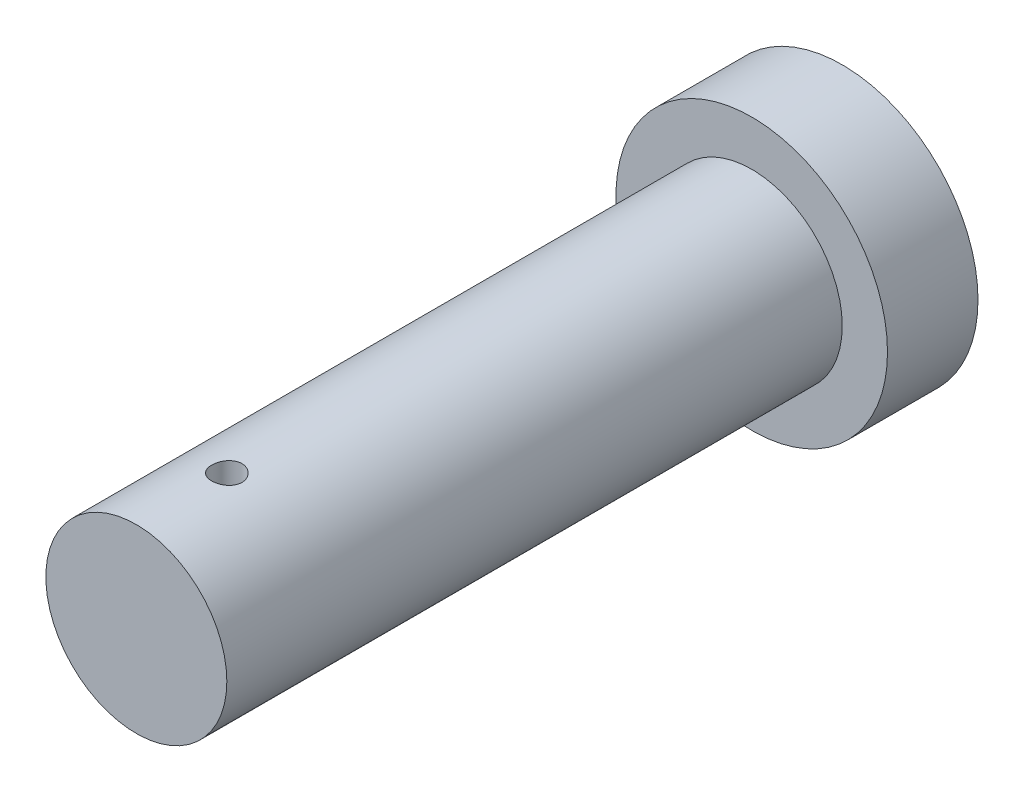
ISO-10303-21;
HEADER;
FILE_DESCRIPTION(('STEP AP214'),'2;1');
FILE_NAME('part.step','',(''),(''),'','','');
FILE_SCHEMA(('AUTOMOTIVE_DESIGN { 1 0 10303 214 1 1 1 1 }'));
ENDSEC;
DATA;
#1=APPLICATION_CONTEXT('core data for automotive mechanical design processes');
#2=APPLICATION_PROTOCOL_DEFINITION('international standard','automotive_design',2000,#1);
#3=PRODUCT_CONTEXT('',#1,'mechanical');
#4=PRODUCT('Part','Part','',(#3));
#5=PRODUCT_RELATED_PRODUCT_CATEGORY('part','',(#4));
#6=PRODUCT_DEFINITION_FORMATION('','',#4);
#7=PRODUCT_DEFINITION_CONTEXT('part definition',#1,'design');
#8=PRODUCT_DEFINITION('design','',#6,#7);
#9=PRODUCT_DEFINITION_SHAPE('','',#8);
#10=(LENGTH_UNIT() NAMED_UNIT(*) SI_UNIT(.MILLI.,.METRE.));
#11=(NAMED_UNIT(*) PLANE_ANGLE_UNIT() SI_UNIT($,.RADIAN.));
#12=(NAMED_UNIT(*) SI_UNIT($,.STERADIAN.) SOLID_ANGLE_UNIT());
#13=UNCERTAINTY_MEASURE_WITH_UNIT(LENGTH_MEASURE(1.E-05),#10,'distance_accuracy_value','');
#14=(GEOMETRIC_REPRESENTATION_CONTEXT(3) GLOBAL_UNCERTAINTY_ASSIGNED_CONTEXT((#13)) GLOBAL_UNIT_ASSIGNED_CONTEXT((#10,
#11,#12)) REPRESENTATION_CONTEXT('',''));
#15=CARTESIAN_POINT('',(0.,0.,0.));
#16=DIRECTION('',(0.,0.,1.));
#17=DIRECTION('',(1.,0.,0.));
#18=AXIS2_PLACEMENT_3D('',#15,#16,#17);
#19=CARTESIAN_POINT('',(0.,0.,15.));
#20=DIRECTION('',(0.,0.,-1.));
#21=DIRECTION('',(-1.,0.,0.));
#22=AXIS2_PLACEMENT_3D('',#19,#20,#21);
#23=CYLINDRICAL_SURFACE('',#22,22.5);
#24=CARTESIAN_POINT('',(0.,0.,15.));
#25=DIRECTION('',(0.,0.,1.));
#26=DIRECTION('',(1.,0.,0.));
#27=AXIS2_PLACEMENT_3D('',#24,#25,#26);
#28=CIRCLE('',#27,22.5);
#29=CARTESIAN_POINT('',(22.5,0.,15.));
#30=VERTEX_POINT('',#29);
#31=EDGE_CURVE('E54',#30,#30,#28,.T.);
#32=ORIENTED_EDGE('',*,*,#31,.F.);
#33=EDGE_LOOP('',(#32));
#34=FACE_BOUND('',#33,.T.);
#35=CARTESIAN_POINT('',(0.,0.,0.));
#36=DIRECTION('',(0.,0.,1.));
#37=DIRECTION('',(1.,0.,0.));
#38=AXIS2_PLACEMENT_3D('',#35,#36,#37);
#39=CIRCLE('',#38,22.5);
#40=CARTESIAN_POINT('',(22.5,0.,0.));
#41=VERTEX_POINT('',#40);
#42=EDGE_CURVE('E60',#41,#41,#39,.T.);
#43=ORIENTED_EDGE('',*,*,#42,.T.);
#44=EDGE_LOOP('',(#43));
#45=FACE_BOUND('',#44,.T.);
#46=ADVANCED_FACE('F41',(#34,#45),#23,.T.);
#47=CARTESIAN_POINT('',(0.,0.,15.));
#48=DIRECTION('',(0.,0.,1.));
#49=DIRECTION('',(1.,0.,0.));
#50=AXIS2_PLACEMENT_3D('',#47,#48,#49);
#51=PLANE('',#50);
#52=CARTESIAN_POINT('',(0.,0.,15.));
#53=DIRECTION('',(0.,0.,1.));
#54=DIRECTION('',(1.,0.,0.));
#55=AXIS2_PLACEMENT_3D('',#52,#53,#54);
#56=CIRCLE('',#55,15.);
#57=CARTESIAN_POINT('',(15.,0.,15.));
#58=VERTEX_POINT('',#57);
#59=EDGE_CURVE('E10',#58,#58,#56,.T.);
#60=ORIENTED_EDGE('',*,*,#59,.F.);
#61=EDGE_LOOP('',(#60));
#62=FACE_BOUND('',#61,.T.);
#63=ORIENTED_EDGE('',*,*,#31,.T.);
#64=EDGE_LOOP('',(#63));
#65=FACE_BOUND('',#64,.T.);
#66=ADVANCED_FACE('F92',(#62,#65),#51,.T.);
#67=CARTESIAN_POINT('',(0.,0.,0.));
#68=DIRECTION('',(0.,0.,1.));
#69=DIRECTION('',(1.,0.,0.));
#70=AXIS2_PLACEMENT_3D('',#67,#68,#69);
#71=PLANE('',#70);
#72=ORIENTED_EDGE('',*,*,#42,.F.);
#73=EDGE_LOOP('',(#72));
#74=FACE_BOUND('',#73,.T.);
#75=ADVANCED_FACE('F88',(#74),#71,.F.);
#76=CARTESIAN_POINT('',(0.,0.,117.));
#77=DIRECTION('',(0.,0.,-1.));
#78=DIRECTION('',(-1.,0.,0.));
#79=AXIS2_PLACEMENT_3D('',#76,#77,#78);
#80=CYLINDRICAL_SURFACE('',#79,15.);
#81=CARTESIAN_POINT('',(0.,-15.,104.5));
#82=CARTESIAN_POINT('',(0.139390904958214,-14.9999976116882,104.499994411052));
#83=CARTESIAN_POINT('',(0.27885788183882,-14.9980367791303,104.488302725031));
#84=CARTESIAN_POINT('',(0.553880221673042,-14.9904034494139,104.441864341235));
#85=CARTESIAN_POINT('',(0.689431867959247,-14.9847275392389,104.407096443088));
#86=CARTESIAN_POINT('',(0.952604747212648,-14.9703006823645,104.315584551407));
#87=CARTESIAN_POINT('',(1.08023236843191,-14.9615522515919,104.258858534359));
#88=CARTESIAN_POINT('',(1.32414184197795,-14.9419422708207,104.125087707948));
#89=CARTESIAN_POINT('',(1.44042498987859,-14.9310809625443,104.048045222517));
#90=CARTESIAN_POINT('',(1.65947261429168,-14.9083331745831,103.87504491618));
#91=CARTESIAN_POINT('',(1.76211290353497,-14.8964387181486,103.778930885364));
#92=CARTESIAN_POINT('',(1.94988849865993,-14.8730262687673,103.570852031527));
#93=CARTESIAN_POINT('',(2.03502269939098,-14.8615082996267,103.458886208543));
#94=CARTESIAN_POINT('',(2.18586712560513,-14.8400756575978,103.221429033803));
#95=CARTESIAN_POINT('',(2.251454552861,-14.8301712909164,103.095858663195));
#96=CARTESIAN_POINT('',(2.36055836541122,-14.8131978979467,102.835290435699));
#97=CARTESIAN_POINT('',(2.40407624156561,-14.8061286801431,102.700293216322));
#98=CARTESIAN_POINT('',(2.46741437778481,-14.7957053684276,102.426019725143));
#99=CARTESIAN_POINT('',(2.48744902913541,-14.792317684857,102.286794263499));
#100=CARTESIAN_POINT('',(2.50391672528988,-14.7895393893665,102.006919723116));
#101=CARTESIAN_POINT('',(2.500351440389,-14.7901484945721,101.866270745833));
#102=CARTESIAN_POINT('',(2.46989509839615,-14.7952642886355,101.589072138725));
#103=CARTESIAN_POINT('',(2.44324488188977,-14.7997307331892,101.452495196455));
#104=CARTESIAN_POINT('',(2.36775314040345,-14.8119949521101,101.185778682171));
#105=CARTESIAN_POINT('',(2.31891085431974,-14.8197928407327,101.055639331111));
#106=CARTESIAN_POINT('',(2.20017724609392,-14.837884793341,100.804771176559));
#107=CARTESIAN_POINT('',(2.13018591387972,-14.8481906710732,100.684090593919));
#108=CARTESIAN_POINT('',(1.97121201755744,-14.8701291841501,100.456095599462));
#109=CARTESIAN_POINT('',(1.88222792065429,-14.8817619265429,100.348782267545));
#110=CARTESIAN_POINT('',(1.68648221215906,-14.9052202787979,100.149173914193));
#111=CARTESIAN_POINT('',(1.57951396387313,-14.9170464923165,100.05708148146));
#112=CARTESIAN_POINT('',(1.35153524898165,-14.9394260139672,99.8921222373346));
#113=CARTESIAN_POINT('',(1.23052469190643,-14.9499793138975,99.8192555498168));
#114=CARTESIAN_POINT('',(0.977705916166718,-14.9686389289291,99.6947977728637));
#115=CARTESIAN_POINT('',(0.845888725564668,-14.9767431840745,99.6432245806687));
#116=CARTESIAN_POINT('',(0.575298345602737,-14.9895750301266,99.563005784754));
#117=CARTESIAN_POINT('',(0.436525739179472,-14.9943029035047,99.5343582630263));
#118=CARTESIAN_POINT('',(0.157709901301626,-14.9998112984269,99.5010786415389));
#119=CARTESIAN_POINT('',(0.0177007371510128,-15.0006375301278,99.4961684281944));
#120=CARTESIAN_POINT('',(-0.261139772889886,-14.9983747442117,99.5097613444281));
#121=CARTESIAN_POINT('',(-0.399971163892037,-14.9952858772412,99.5282635731337));
#122=CARTESIAN_POINT('',(-0.671656175546763,-14.985568269382,99.5879248493355));
#123=CARTESIAN_POINT('',(-0.80454086838538,-14.9789610480131,99.6289462083901));
#124=CARTESIAN_POINT('',(-1.06154688486044,-14.9629446445536,99.7323345181995));
#125=CARTESIAN_POINT('',(-1.18566771590972,-14.9535353051202,99.7947026676353));
#126=CARTESIAN_POINT('',(-1.42283068946896,-14.9328451630241,99.9396511246968));
#127=CARTESIAN_POINT('',(-1.53576525093715,-14.9215485588702,100.022405156167));
#128=CARTESIAN_POINT('',(-1.74624358550269,-14.898384673919,100.205537315385));
#129=CARTESIAN_POINT('',(-1.84378623969659,-14.8865173517155,100.305916723277));
#130=CARTESIAN_POINT('',(-2.02174277965801,-14.8634017523585,100.522697548071));
#131=CARTESIAN_POINT('',(-2.10196876111372,-14.8521611613711,100.639254165514));
#132=CARTESIAN_POINT('',(-2.24170231029499,-14.8317152977788,100.884352969139));
#133=CARTESIAN_POINT('',(-2.30121053476983,-14.8225099606602,101.012894775227));
#134=CARTESIAN_POINT('',(-2.39753833147315,-14.807234536977,101.277789732812));
#135=CARTESIAN_POINT('',(-2.43445143254795,-14.8011515431106,101.41410809503));
#136=CARTESIAN_POINT('',(-2.48483545377828,-14.7927771683526,101.691120129222));
#137=CARTESIAN_POINT('',(-2.49830841194617,-14.7904854578272,101.831813419732));
#138=CARTESIAN_POINT('',(-2.50137286604736,-14.7899673308401,102.111705165962));
#139=CARTESIAN_POINT('',(-2.49126013612519,-14.7916905650565,102.250900378575));
#140=CARTESIAN_POINT('',(-2.44807983895685,-14.7988978145373,102.525579248051));
#141=CARTESIAN_POINT('',(-2.41501234611248,-14.8043818176121,102.661062916942));
#142=CARTESIAN_POINT('',(-2.32697448959491,-14.8184735628172,102.924358437293));
#143=CARTESIAN_POINT('',(-2.27202959060045,-14.8270776721967,103.052179010056));
#144=CARTESIAN_POINT('',(-2.14182700391591,-14.8464436892221,103.296835669195));
#145=CARTESIAN_POINT('',(-2.06656830874857,-14.857205703884,103.413671210372));
#146=CARTESIAN_POINT('',(-1.89681888437216,-14.8798345404562,103.634535583108));
#147=CARTESIAN_POINT('',(-1.80211056359365,-14.891712955763,103.7383960167));
#148=CARTESIAN_POINT('',(-1.59660903138024,-14.9151437236084,103.928851604475));
#149=CARTESIAN_POINT('',(-1.48581211291264,-14.9266960002655,104.015442768638));
#150=CARTESIAN_POINT('',(-1.25036916964029,-14.9482652964222,104.1694482682));
#151=CARTESIAN_POINT('',(-1.12563278753283,-14.958271162531,104.236726039313));
#152=CARTESIAN_POINT('',(-0.866513069378989,-14.9755116760178,104.34926948461));
#153=CARTESIAN_POINT('',(-0.732139494830016,-14.9827490817748,104.39455708108));
#154=CARTESIAN_POINT('',(-0.497703310045405,-14.9920579083296,104.452005274127));
#155=CARTESIAN_POINT('',(-0.39905883029845,-14.9950202727336,104.469974469616));
#156=CARTESIAN_POINT('',(-0.20028931031981,-14.9989921598612,104.493973737845));
#157=CARTESIAN_POINT('',(-0.100164295608495,-15.0000017162064,104.500004016137));
#158=CARTESIAN_POINT('',(0.,-15.,104.5));
#159=B_SPLINE_CURVE_WITH_KNOTS('',3,(#81,#82,#83,#84,#85,#86,#87,#88,#89,#90,#91,#92,#93,#94,
#95,#96,#97,#98,#99,#100,#101,#102,#103,#104,#105,#106,#107,#108,#109,#110,#111,#112,#113,#114,
#115,#116,#117,#118,#119,#120,#121,#122,#123,#124,#125,#126,#127,#128,#129,#130,#131,#132,#133,
#134,#135,#136,#137,#138,#139,#140,#141,#142,#143,#144,#145,#146,#147,#148,#149,#150,#151,#152,
#153,#154,#155,#156,#157,#158),.UNSPECIFIED.,.T.,.F.,(4,2,2,2,2,2,2,2,2,2,2,2,2,2,2,2,2,2,2,2,2,
2,2,2,2,2,2,2,2,2,2,2,2,2,2,2,2,2,4),(0.,0.417806584938509,0.835997545695419,1.25384686702528,
1.67164841267479,2.09302491062333,2.51442800169857,2.9384252082384,3.3623937687618,
3.78246077103427,4.20249804320887,4.61820521760409,5.03392665025381,5.45164556632557,
5.86939820680573,6.29232769911327,6.71525991635848,7.13854688915903,7.56179844521149,
7.98007883491398,8.3983431303586,8.81407807006416,9.22983635826067,9.64926825627025,
10.0687306305428,10.4925382200762,10.9163323737594,11.3383602234177,11.7603513778662,
12.177079095227,12.5938054618813,13.0100481822622,13.4263115502934,13.8475138419339,
14.2688133387897,14.693022316072,15.1168075213007,15.4170424816402,15.7172722727697),.UNSPECIFIED.);
#160=CARTESIAN_POINT('',(0.,-15.,104.5));
#161=VERTEX_POINT('',#160);
#162=EDGE_CURVE('E44',#161,#161,#159,.T.);
#163=ORIENTED_EDGE('',*,*,#162,.T.);
#164=EDGE_LOOP('',(#163));
#165=FACE_BOUND('',#164,.T.);
#166=CARTESIAN_POINT('',(0.,15.,104.5));
#167=CARTESIAN_POINT('',(-0.139390904958214,14.9999976116882,104.499994411052));
#168=CARTESIAN_POINT('',(-0.27885788183882,14.9980367791303,104.488302725031));
#169=CARTESIAN_POINT('',(-0.553880221673042,14.9904034494139,104.441864341235));
#170=CARTESIAN_POINT('',(-0.689431867959247,14.9847275392389,104.407096443088));
#171=CARTESIAN_POINT('',(-0.952604747212648,14.9703006823645,104.315584551407));
#172=CARTESIAN_POINT('',(-1.08023236843191,14.9615522515919,104.258858534359));
#173=CARTESIAN_POINT('',(-1.32414184197795,14.9419422708207,104.125087707948));
#174=CARTESIAN_POINT('',(-1.44042498987859,14.9310809625443,104.048045222517));
#175=CARTESIAN_POINT('',(-1.65947261429168,14.9083331745831,103.87504491618));
#176=CARTESIAN_POINT('',(-1.76211290353497,14.8964387181486,103.778930885364));
#177=CARTESIAN_POINT('',(-1.94988849865993,14.8730262687673,103.570852031527));
#178=CARTESIAN_POINT('',(-2.03502269939098,14.8615082996267,103.458886208543));
#179=CARTESIAN_POINT('',(-2.18586712560513,14.8400756575978,103.221429033803));
#180=CARTESIAN_POINT('',(-2.251454552861,14.8301712909164,103.095858663195));
#181=CARTESIAN_POINT('',(-2.36055836541122,14.8131978979467,102.835290435699));
#182=CARTESIAN_POINT('',(-2.40407624156561,14.8061286801431,102.700293216322));
#183=CARTESIAN_POINT('',(-2.46741437778481,14.7957053684276,102.426019725143));
#184=CARTESIAN_POINT('',(-2.48744902913541,14.792317684857,102.286794263499));
#185=CARTESIAN_POINT('',(-2.50391672528988,14.7895393893665,102.006919723116));
#186=CARTESIAN_POINT('',(-2.500351440389,14.7901484945721,101.866270745833));
#187=CARTESIAN_POINT('',(-2.46989509839615,14.7952642886355,101.589072138725));
#188=CARTESIAN_POINT('',(-2.44324488188977,14.7997307331892,101.452495196455));
#189=CARTESIAN_POINT('',(-2.36775314040345,14.8119949521101,101.185778682171));
#190=CARTESIAN_POINT('',(-2.31891085431974,14.8197928407327,101.055639331111));
#191=CARTESIAN_POINT('',(-2.20017724609392,14.837884793341,100.804771176559));
#192=CARTESIAN_POINT('',(-2.13018591387972,14.8481906710732,100.684090593919));
#193=CARTESIAN_POINT('',(-1.97121201755744,14.8701291841501,100.456095599462));
#194=CARTESIAN_POINT('',(-1.88222792065429,14.8817619265429,100.348782267545));
#195=CARTESIAN_POINT('',(-1.68648221215906,14.9052202787979,100.149173914193));
#196=CARTESIAN_POINT('',(-1.57951396387313,14.9170464923165,100.05708148146));
#197=CARTESIAN_POINT('',(-1.35153524898165,14.9394260139672,99.8921222373346));
#198=CARTESIAN_POINT('',(-1.23052469190643,14.9499793138975,99.8192555498168));
#199=CARTESIAN_POINT('',(-0.977705916166718,14.9686389289291,99.6947977728637));
#200=CARTESIAN_POINT('',(-0.845888725564668,14.9767431840745,99.6432245806687));
#201=CARTESIAN_POINT('',(-0.575298345602737,14.9895750301266,99.563005784754));
#202=CARTESIAN_POINT('',(-0.436525739179472,14.9943029035047,99.5343582630263));
#203=CARTESIAN_POINT('',(-0.157709901301626,14.9998112984269,99.5010786415389));
#204=CARTESIAN_POINT('',(-0.0177007371510128,15.0006375301278,99.4961684281944));
#205=CARTESIAN_POINT('',(0.261139772889886,14.9983747442117,99.5097613444281));
#206=CARTESIAN_POINT('',(0.399971163892037,14.9952858772412,99.5282635731337));
#207=CARTESIAN_POINT('',(0.671656175546763,14.985568269382,99.5879248493355));
#208=CARTESIAN_POINT('',(0.80454086838538,14.9789610480131,99.6289462083901));
#209=CARTESIAN_POINT('',(1.06154688486044,14.9629446445536,99.7323345181995));
#210=CARTESIAN_POINT('',(1.18566771590972,14.9535353051202,99.7947026676353));
#211=CARTESIAN_POINT('',(1.42283068946896,14.9328451630241,99.9396511246968));
#212=CARTESIAN_POINT('',(1.53576525093715,14.9215485588702,100.022405156167));
#213=CARTESIAN_POINT('',(1.74624358550269,14.898384673919,100.205537315385));
#214=CARTESIAN_POINT('',(1.84378623969659,14.8865173517155,100.305916723277));
#215=CARTESIAN_POINT('',(2.02174277965801,14.8634017523585,100.522697548071));
#216=CARTESIAN_POINT('',(2.10196876111372,14.8521611613711,100.639254165514));
#217=CARTESIAN_POINT('',(2.24170231029499,14.8317152977788,100.884352969139));
#218=CARTESIAN_POINT('',(2.30121053476983,14.8225099606602,101.012894775227));
#219=CARTESIAN_POINT('',(2.39753833147315,14.807234536977,101.277789732812));
#220=CARTESIAN_POINT('',(2.43445143254795,14.8011515431106,101.41410809503));
#221=CARTESIAN_POINT('',(2.48483545377828,14.7927771683526,101.691120129222));
#222=CARTESIAN_POINT('',(2.49830841194617,14.7904854578272,101.831813419732));
#223=CARTESIAN_POINT('',(2.50137286604736,14.7899673308401,102.111705165962));
#224=CARTESIAN_POINT('',(2.49126013612519,14.7916905650565,102.250900378575));
#225=CARTESIAN_POINT('',(2.44807983895685,14.7988978145373,102.525579248051));
#226=CARTESIAN_POINT('',(2.41501234611248,14.8043818176121,102.661062916942));
#227=CARTESIAN_POINT('',(2.32697448959491,14.8184735628172,102.924358437293));
#228=CARTESIAN_POINT('',(2.27202959060045,14.8270776721967,103.052179010056));
#229=CARTESIAN_POINT('',(2.14182700391591,14.8464436892221,103.296835669195));
#230=CARTESIAN_POINT('',(2.06656830874857,14.857205703884,103.413671210372));
#231=CARTESIAN_POINT('',(1.89681888437216,14.8798345404562,103.634535583108));
#232=CARTESIAN_POINT('',(1.80211056359365,14.891712955763,103.7383960167));
#233=CARTESIAN_POINT('',(1.59660903138024,14.9151437236084,103.928851604475));
#234=CARTESIAN_POINT('',(1.48581211291264,14.9266960002655,104.015442768638));
#235=CARTESIAN_POINT('',(1.25036916964029,14.9482652964222,104.1694482682));
#236=CARTESIAN_POINT('',(1.12563278753283,14.958271162531,104.236726039313));
#237=CARTESIAN_POINT('',(0.866513069378989,14.9755116760178,104.34926948461));
#238=CARTESIAN_POINT('',(0.732139494830016,14.9827490817748,104.39455708108));
#239=CARTESIAN_POINT('',(0.497703310045405,14.9920579083296,104.452005274127));
#240=CARTESIAN_POINT('',(0.39905883029845,14.9950202727336,104.469974469616));
#241=CARTESIAN_POINT('',(0.20028931031981,14.9989921598612,104.493973737845));
#242=CARTESIAN_POINT('',(0.100164295608495,15.0000017162064,104.500004016137));
#243=CARTESIAN_POINT('',(0.,15.,104.5));
#244=B_SPLINE_CURVE_WITH_KNOTS('',3,(#166,#167,#168,#169,#170,#171,#172,#173,#174,#175,#176,
#177,#178,#179,#180,#181,#182,#183,#184,#185,#186,#187,#188,#189,#190,#191,#192,#193,#194,#195,
#196,#197,#198,#199,#200,#201,#202,#203,#204,#205,#206,#207,#208,#209,#210,#211,#212,#213,#214,
#215,#216,#217,#218,#219,#220,#221,#222,#223,#224,#225,#226,#227,#228,#229,#230,#231,#232,#233,
#234,#235,#236,#237,#238,#239,#240,#241,#242,#243),.UNSPECIFIED.,.T.,.F.,(4,2,2,2,2,2,2,2,2,2,2,
2,2,2,2,2,2,2,2,2,2,2,2,2,2,2,2,2,2,2,2,2,2,2,2,2,2,2,4),(0.,0.417806584938509,
0.835997545695419,1.25384686702528,1.67164841267479,2.09302491062333,2.51442800169857,
2.9384252082384,3.3623937687618,3.78246077103427,4.20249804320887,4.61820521760409,
5.03392665025381,5.45164556632557,5.86939820680573,6.29232769911327,6.71525991635848,
7.13854688915903,7.56179844521149,7.98007883491398,8.3983431303586,8.81407807006416,
9.22983635826067,9.64926825627025,10.0687306305428,10.4925382200762,10.9163323737594,
11.3383602234177,11.7603513778662,12.177079095227,12.5938054618813,13.0100481822622,
13.4263115502934,13.8475138419339,14.2688133387897,14.693022316072,15.1168075213007,
15.4170424816402,15.7172722727697),.UNSPECIFIED.);
#245=CARTESIAN_POINT('',(0.,15.,104.5));
#246=VERTEX_POINT('',#245);
#247=EDGE_CURVE('E67',#246,#246,#244,.T.);
#248=ORIENTED_EDGE('',*,*,#247,.T.);
#249=EDGE_LOOP('',(#248));
#250=FACE_BOUND('',#249,.T.);
#251=CARTESIAN_POINT('',(0.,0.,117.));
#252=DIRECTION('',(0.,0.,1.));
#253=DIRECTION('',(1.,0.,0.));
#254=AXIS2_PLACEMENT_3D('',#251,#252,#253);
#255=CIRCLE('',#254,15.);
#256=CARTESIAN_POINT('',(15.,0.,117.));
#257=VERTEX_POINT('',#256);
#258=EDGE_CURVE('E63',#257,#257,#255,.T.);
#259=ORIENTED_EDGE('',*,*,#258,.F.);
#260=EDGE_LOOP('',(#259));
#261=FACE_BOUND('',#260,.T.);
#262=ORIENTED_EDGE('',*,*,#59,.T.);
#263=EDGE_LOOP('',(#262));
#264=FACE_BOUND('',#263,.T.);
#265=ADVANCED_FACE('F73',(#165,#250,#261,#264),#80,.T.);
#266=CARTESIAN_POINT('',(0.,0.,117.));
#267=DIRECTION('',(0.,0.,1.));
#268=DIRECTION('',(1.,0.,0.));
#269=AXIS2_PLACEMENT_3D('',#266,#267,#268);
#270=PLANE('',#269);
#271=ORIENTED_EDGE('',*,*,#258,.T.);
#272=EDGE_LOOP('',(#271));
#273=FACE_BOUND('',#272,.T.);
#274=ADVANCED_FACE('F80',(#273),#270,.T.);
#275=CARTESIAN_POINT('',(0.,-51.,102.));
#276=DIRECTION('',(0.,1.,0.));
#277=DIRECTION('',(0.,0.,1.));
#278=AXIS2_PLACEMENT_3D('',#275,#276,#277);
#279=CYLINDRICAL_SURFACE('',#278,2.5);
#280=ORIENTED_EDGE('',*,*,#247,.F.);
#281=EDGE_LOOP('',(#280));
#282=FACE_BOUND('',#281,.T.);
#283=ORIENTED_EDGE('',*,*,#162,.F.);
#284=EDGE_LOOP('',(#283));
#285=FACE_BOUND('',#284,.T.);
#286=ADVANCED_FACE('F77',(#282,#285),#279,.F.);
#287=CLOSED_SHELL('',(#46,#66,#75,#265,#274,#286));
#288=MANIFOLD_SOLID_BREP('B2',#287);
#289=ADVANCED_BREP_SHAPE_REPRESENTATION('',(#18,#288),#14);
#290=SHAPE_DEFINITION_REPRESENTATION(#9,#289);
ENDSEC;
END-ISO-10303-21;
